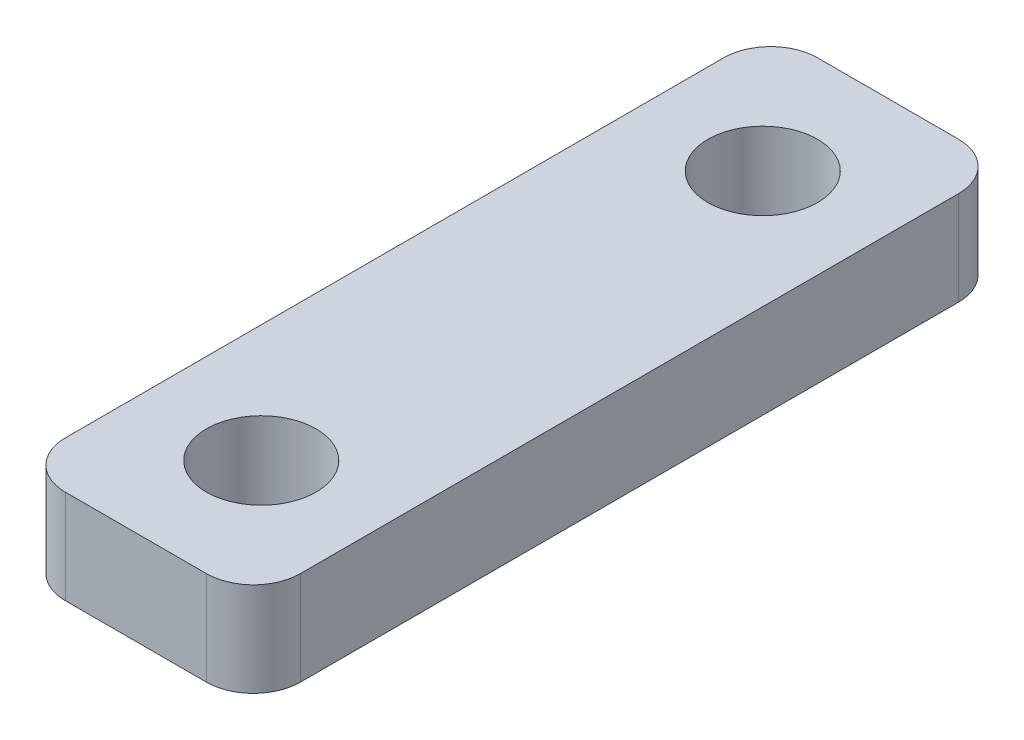
ISO-10303-21;
HEADER;
FILE_DESCRIPTION(('STEP AP214'),'2;1');
FILE_NAME('part.step','',(''),(''),'','','');
FILE_SCHEMA(('AUTOMOTIVE_DESIGN { 1 0 10303 214 1 1 1 1 }'));
ENDSEC;
DATA;
#1=APPLICATION_CONTEXT('core data for automotive mechanical design processes');
#2=APPLICATION_PROTOCOL_DEFINITION('international standard','automotive_design',2000,#1);
#3=PRODUCT_CONTEXT('',#1,'mechanical');
#4=PRODUCT('Part','Part','',(#3));
#5=PRODUCT_RELATED_PRODUCT_CATEGORY('part','',(#4));
#6=PRODUCT_DEFINITION_FORMATION('','',#4);
#7=PRODUCT_DEFINITION_CONTEXT('part definition',#1,'design');
#8=PRODUCT_DEFINITION('design','',#6,#7);
#9=PRODUCT_DEFINITION_SHAPE('','',#8);
#10=(LENGTH_UNIT() NAMED_UNIT(*) SI_UNIT(.MILLI.,.METRE.));
#11=(NAMED_UNIT(*) PLANE_ANGLE_UNIT() SI_UNIT($,.RADIAN.));
#12=(NAMED_UNIT(*) SI_UNIT($,.STERADIAN.) SOLID_ANGLE_UNIT());
#13=UNCERTAINTY_MEASURE_WITH_UNIT(LENGTH_MEASURE(1.E-05),#10,'distance_accuracy_value','');
#14=(GEOMETRIC_REPRESENTATION_CONTEXT(3) GLOBAL_UNCERTAINTY_ASSIGNED_CONTEXT((#13)) GLOBAL_UNIT_ASSIGNED_CONTEXT((#10,
#11,#12)) REPRESENTATION_CONTEXT('',''));
#15=CARTESIAN_POINT('',(0.,0.,0.));
#16=DIRECTION('',(0.,0.,1.));
#17=DIRECTION('',(1.,0.,0.));
#18=AXIS2_PLACEMENT_3D('',#15,#16,#17);
#19=CARTESIAN_POINT('',(3.,6.,0.));
#20=DIRECTION('',(0.,-1.,0.));
#21=DIRECTION('',(0.,0.,-1.));
#22=AXIS2_PLACEMENT_3D('',#19,#20,#21);
#23=PLANE('',#22);
#24=CARTESIAN_POINT('',(3.,6.,0.));
#25=DIRECTION('',(0.,1.,0.));
#26=DIRECTION('',(0.,0.,-1.));
#27=AXIS2_PLACEMENT_3D('',#24,#25,#26);
#28=CIRCLE('',#27,3.);
#29=CARTESIAN_POINT('',(0.,6.,0.));
#30=VERTEX_POINT('',#29);
#31=CARTESIAN_POINT('',(3.,6.,3.));
#32=VERTEX_POINT('',#31);
#33=EDGE_CURVE('E160',#30,#32,#28,.T.);
#34=ORIENTED_EDGE('',*,*,#33,.T.);
#35=DIRECTION('',(1.,0.,0.));
#36=VECTOR('',#35,1.);
#37=CARTESIAN_POINT('',(12.,6.,3.));
#38=LINE('',#37,#36);
#39=CARTESIAN_POINT('',(12.,6.,3.));
#40=VERTEX_POINT('',#39);
#41=EDGE_CURVE('E95',#32,#40,#38,.T.);
#42=ORIENTED_EDGE('',*,*,#41,.T.);
#43=CARTESIAN_POINT('',(12.,6.,0.));
#44=DIRECTION('',(0.,1.,0.));
#45=DIRECTION('',(0.,0.,-1.));
#46=AXIS2_PLACEMENT_3D('',#43,#44,#45);
#47=CIRCLE('',#46,3.);
#48=CARTESIAN_POINT('',(15.,6.,0.));
#49=VERTEX_POINT('',#48);
#50=EDGE_CURVE('E182',#40,#49,#47,.T.);
#51=ORIENTED_EDGE('',*,*,#50,.T.);
#52=DIRECTION('',(0.,0.,-1.));
#53=VECTOR('',#52,1.);
#54=CARTESIAN_POINT('',(15.,6.,-42.));
#55=LINE('',#54,#53);
#56=CARTESIAN_POINT('',(15.,6.,-42.));
#57=VERTEX_POINT('',#56);
#58=EDGE_CURVE('E196',#49,#57,#55,.T.);
#59=ORIENTED_EDGE('',*,*,#58,.T.);
#60=CARTESIAN_POINT('',(12.,6.,-42.));
#61=DIRECTION('',(0.,1.,0.));
#62=DIRECTION('',(0.,0.,-1.));
#63=AXIS2_PLACEMENT_3D('',#60,#61,#62);
#64=CIRCLE('',#63,3.);
#65=CARTESIAN_POINT('',(12.,6.,-45.));
#66=VERTEX_POINT('',#65);
#67=EDGE_CURVE('E114',#57,#66,#64,.T.);
#68=ORIENTED_EDGE('',*,*,#67,.T.);
#69=DIRECTION('',(-1.,0.,0.));
#70=VECTOR('',#69,1.);
#71=CARTESIAN_POINT('',(3.,6.,-45.));
#72=LINE('',#71,#70);
#73=CARTESIAN_POINT('',(3.,6.,-45.));
#74=VERTEX_POINT('',#73);
#75=EDGE_CURVE('E108',#66,#74,#72,.T.);
#76=ORIENTED_EDGE('',*,*,#75,.T.);
#77=CARTESIAN_POINT('',(3.,6.,-42.));
#78=DIRECTION('',(0.,1.,0.));
#79=DIRECTION('',(0.,0.,-1.));
#80=AXIS2_PLACEMENT_3D('',#77,#78,#79);
#81=CIRCLE('',#80,3.);
#82=CARTESIAN_POINT('',(0.,6.,-42.));
#83=VERTEX_POINT('',#82);
#84=EDGE_CURVE('E112',#74,#83,#81,.T.);
#85=ORIENTED_EDGE('',*,*,#84,.T.);
#86=DIRECTION('',(0.,0.,1.));
#87=VECTOR('',#86,1.);
#88=CARTESIAN_POINT('',(0.,6.,0.));
#89=LINE('',#88,#87);
#90=EDGE_CURVE('E52',#83,#30,#89,.T.);
#91=ORIENTED_EDGE('',*,*,#90,.T.);
#92=EDGE_LOOP('',(#34,#42,#51,#59,#68,#76,#85,#91));
#93=FACE_BOUND('',#92,.T.);
#94=CARTESIAN_POINT('',(7.5,6.,-37.));
#95=DIRECTION('',(0.,1.,0.));
#96=DIRECTION('',(0.,0.,1.));
#97=AXIS2_PLACEMENT_3D('',#94,#95,#96);
#98=CIRCLE('',#97,3.5);
#99=CARTESIAN_POINT('',(7.5,6.,-33.5));
#100=VERTEX_POINT('',#99);
#101=EDGE_CURVE('E142',#100,#100,#98,.T.);
#102=ORIENTED_EDGE('',*,*,#101,.F.);
#103=EDGE_LOOP('',(#102));
#104=FACE_BOUND('',#103,.T.);
#105=CARTESIAN_POINT('',(7.50000000000001,6.,-5.));
#106=DIRECTION('',(0.,1.,0.));
#107=DIRECTION('',(0.,0.,1.));
#108=AXIS2_PLACEMENT_3D('',#105,#106,#107);
#109=CIRCLE('',#108,3.5);
#110=CARTESIAN_POINT('',(7.50000000000001,6.,-1.5));
#111=VERTEX_POINT('',#110);
#112=EDGE_CURVE('E211',#111,#111,#109,.T.);
#113=ORIENTED_EDGE('',*,*,#112,.F.);
#114=EDGE_LOOP('',(#113));
#115=FACE_BOUND('',#114,.T.);
#116=ADVANCED_FACE('F34',(#93,#104,#115),#23,.F.);
#117=CARTESIAN_POINT('',(3.,0.,0.));
#118=DIRECTION('',(0.,-1.,0.));
#119=DIRECTION('',(0.,0.,-1.));
#120=AXIS2_PLACEMENT_3D('',#117,#118,#119);
#121=PLANE('',#120);
#122=CARTESIAN_POINT('',(7.5,0.,-37.));
#123=DIRECTION('',(0.,1.,0.));
#124=DIRECTION('',(0.,0.,1.));
#125=AXIS2_PLACEMENT_3D('',#122,#123,#124);
#126=CIRCLE('',#125,3.5);
#127=CARTESIAN_POINT('',(7.5,0.,-33.5));
#128=VERTEX_POINT('',#127);
#129=EDGE_CURVE('E207',#128,#128,#126,.T.);
#130=ORIENTED_EDGE('',*,*,#129,.T.);
#131=EDGE_LOOP('',(#130));
#132=FACE_BOUND('',#131,.T.);
#133=CARTESIAN_POINT('',(3.,0.,0.));
#134=DIRECTION('',(0.,1.,0.));
#135=DIRECTION('',(0.,0.,-1.));
#136=AXIS2_PLACEMENT_3D('',#133,#134,#135);
#137=CIRCLE('',#136,3.);
#138=CARTESIAN_POINT('',(0.,0.,0.));
#139=VERTEX_POINT('',#138);
#140=CARTESIAN_POINT('',(3.,0.,3.));
#141=VERTEX_POINT('',#140);
#142=EDGE_CURVE('E137',#139,#141,#137,.T.);
#143=ORIENTED_EDGE('',*,*,#142,.F.);
#144=DIRECTION('',(0.,0.,1.));
#145=VECTOR('',#144,1.);
#146=CARTESIAN_POINT('',(0.,0.,0.));
#147=LINE('',#146,#145);
#148=CARTESIAN_POINT('',(0.,0.,-42.));
#149=VERTEX_POINT('',#148);
#150=EDGE_CURVE('E87',#149,#139,#147,.T.);
#151=ORIENTED_EDGE('',*,*,#150,.F.);
#152=CARTESIAN_POINT('',(3.,0.,-42.));
#153=DIRECTION('',(0.,1.,0.));
#154=DIRECTION('',(0.,0.,-1.));
#155=AXIS2_PLACEMENT_3D('',#152,#153,#154);
#156=CIRCLE('',#155,3.);
#157=CARTESIAN_POINT('',(3.,0.,-45.));
#158=VERTEX_POINT('',#157);
#159=EDGE_CURVE('E81',#158,#149,#156,.T.);
#160=ORIENTED_EDGE('',*,*,#159,.F.);
#161=DIRECTION('',(-1.,0.,0.));
#162=VECTOR('',#161,1.);
#163=CARTESIAN_POINT('',(3.,0.,-45.));
#164=LINE('',#163,#162);
#165=CARTESIAN_POINT('',(12.,0.,-45.));
#166=VERTEX_POINT('',#165);
#167=EDGE_CURVE('E123',#166,#158,#164,.T.);
#168=ORIENTED_EDGE('',*,*,#167,.F.);
#169=CARTESIAN_POINT('',(12.,0.,-42.));
#170=DIRECTION('',(0.,1.,0.));
#171=DIRECTION('',(0.,0.,-1.));
#172=AXIS2_PLACEMENT_3D('',#169,#170,#171);
#173=CIRCLE('',#172,3.);
#174=CARTESIAN_POINT('',(15.,0.,-42.));
#175=VERTEX_POINT('',#174);
#176=EDGE_CURVE('E151',#175,#166,#173,.T.);
#177=ORIENTED_EDGE('',*,*,#176,.F.);
#178=DIRECTION('',(0.,0.,-1.));
#179=VECTOR('',#178,1.);
#180=CARTESIAN_POINT('',(15.,0.,-42.));
#181=LINE('',#180,#179);
#182=CARTESIAN_POINT('',(15.,0.,0.));
#183=VERTEX_POINT('',#182);
#184=EDGE_CURVE('E148',#183,#175,#181,.T.);
#185=ORIENTED_EDGE('',*,*,#184,.F.);
#186=CARTESIAN_POINT('',(12.,0.,0.));
#187=DIRECTION('',(0.,1.,0.));
#188=DIRECTION('',(0.,0.,-1.));
#189=AXIS2_PLACEMENT_3D('',#186,#187,#188);
#190=CIRCLE('',#189,3.);
#191=CARTESIAN_POINT('',(12.,0.,3.));
#192=VERTEX_POINT('',#191);
#193=EDGE_CURVE('E145',#192,#183,#190,.T.);
#194=ORIENTED_EDGE('',*,*,#193,.F.);
#195=DIRECTION('',(1.,0.,0.));
#196=VECTOR('',#195,1.);
#197=CARTESIAN_POINT('',(12.,0.,3.));
#198=LINE('',#197,#196);
#199=EDGE_CURVE('E141',#141,#192,#198,.T.);
#200=ORIENTED_EDGE('',*,*,#199,.F.);
#201=EDGE_LOOP('',(#143,#151,#160,#168,#177,#185,#194,#200));
#202=FACE_BOUND('',#201,.T.);
#203=CARTESIAN_POINT('',(7.50000000000001,0.,-5.));
#204=DIRECTION('',(0.,1.,0.));
#205=DIRECTION('',(0.,0.,1.));
#206=AXIS2_PLACEMENT_3D('',#203,#204,#205);
#207=CIRCLE('',#206,3.5);
#208=CARTESIAN_POINT('',(7.50000000000001,0.,-1.5));
#209=VERTEX_POINT('',#208);
#210=EDGE_CURVE('E215',#209,#209,#207,.T.);
#211=ORIENTED_EDGE('',*,*,#210,.T.);
#212=EDGE_LOOP('',(#211));
#213=FACE_BOUND('',#212,.T.);
#214=ADVANCED_FACE('F186',(#132,#202,#213),#121,.T.);
#215=CARTESIAN_POINT('',(3.,6.,0.));
#216=DIRECTION('',(0.,-1.,0.));
#217=DIRECTION('',(0.,0.,-1.));
#218=AXIS2_PLACEMENT_3D('',#215,#216,#217);
#219=CYLINDRICAL_SURFACE('',#218,3.);
#220=ORIENTED_EDGE('',*,*,#142,.T.);
#221=DIRECTION('',(0.,-1.,0.));
#222=VECTOR('',#221,1.);
#223=CARTESIAN_POINT('',(3.,6.,3.));
#224=LINE('',#223,#222);
#225=EDGE_CURVE('E11',#32,#141,#224,.T.);
#226=ORIENTED_EDGE('',*,*,#225,.F.);
#227=ORIENTED_EDGE('',*,*,#33,.F.);
#228=DIRECTION('',(0.,-1.,0.));
#229=VECTOR('',#228,1.);
#230=CARTESIAN_POINT('',(0.,6.,0.));
#231=LINE('',#230,#229);
#232=EDGE_CURVE('E133',#30,#139,#231,.T.);
#233=ORIENTED_EDGE('',*,*,#232,.T.);
#234=EDGE_LOOP('',(#220,#226,#227,#233));
#235=FACE_BOUND('',#234,.T.);
#236=ADVANCED_FACE('F36',(#235),#219,.T.);
#237=CARTESIAN_POINT('',(12.,6.,3.));
#238=DIRECTION('',(0.,0.,-1.));
#239=DIRECTION('',(-1.,0.,0.));
#240=AXIS2_PLACEMENT_3D('',#237,#238,#239);
#241=PLANE('',#240);
#242=ORIENTED_EDGE('',*,*,#199,.T.);
#243=DIRECTION('',(0.,-1.,0.));
#244=VECTOR('',#243,1.);
#245=CARTESIAN_POINT('',(12.,6.,3.));
#246=LINE('',#245,#244);
#247=EDGE_CURVE('E44',#40,#192,#246,.T.);
#248=ORIENTED_EDGE('',*,*,#247,.F.);
#249=ORIENTED_EDGE('',*,*,#41,.F.);
#250=ORIENTED_EDGE('',*,*,#225,.T.);
#251=EDGE_LOOP('',(#242,#248,#249,#250));
#252=FACE_BOUND('',#251,.T.);
#253=ADVANCED_FACE('F250',(#252),#241,.F.);
#254=CARTESIAN_POINT('',(12.,6.,0.));
#255=DIRECTION('',(0.,-1.,0.));
#256=DIRECTION('',(0.,0.,-1.));
#257=AXIS2_PLACEMENT_3D('',#254,#255,#256);
#258=CYLINDRICAL_SURFACE('',#257,3.);
#259=ORIENTED_EDGE('',*,*,#193,.T.);
#260=DIRECTION('',(0.,-1.,0.));
#261=VECTOR('',#260,1.);
#262=CARTESIAN_POINT('',(15.,6.,0.));
#263=LINE('',#262,#261);
#264=EDGE_CURVE('E171',#49,#183,#263,.T.);
#265=ORIENTED_EDGE('',*,*,#264,.F.);
#266=ORIENTED_EDGE('',*,*,#50,.F.);
#267=ORIENTED_EDGE('',*,*,#247,.T.);
#268=EDGE_LOOP('',(#259,#265,#266,#267));
#269=FACE_BOUND('',#268,.T.);
#270=ADVANCED_FACE('F180',(#269),#258,.T.);
#271=CARTESIAN_POINT('',(15.,6.,-42.));
#272=DIRECTION('',(-1.,0.,0.));
#273=DIRECTION('',(0.,0.,1.));
#274=AXIS2_PLACEMENT_3D('',#271,#272,#273);
#275=PLANE('',#274);
#276=ORIENTED_EDGE('',*,*,#184,.T.);
#277=DIRECTION('',(0.,-1.,0.));
#278=VECTOR('',#277,1.);
#279=CARTESIAN_POINT('',(15.,6.,-42.));
#280=LINE('',#279,#278);
#281=EDGE_CURVE('E167',#57,#175,#280,.T.);
#282=ORIENTED_EDGE('',*,*,#281,.F.);
#283=ORIENTED_EDGE('',*,*,#58,.F.);
#284=ORIENTED_EDGE('',*,*,#264,.T.);
#285=EDGE_LOOP('',(#276,#282,#283,#284));
#286=FACE_BOUND('',#285,.T.);
#287=ADVANCED_FACE('F191',(#286),#275,.F.);
#288=CARTESIAN_POINT('',(12.,6.,-42.));
#289=DIRECTION('',(0.,-1.,0.));
#290=DIRECTION('',(0.,0.,-1.));
#291=AXIS2_PLACEMENT_3D('',#288,#289,#290);
#292=CYLINDRICAL_SURFACE('',#291,3.);
#293=ORIENTED_EDGE('',*,*,#176,.T.);
#294=DIRECTION('',(0.,-1.,0.));
#295=VECTOR('',#294,1.);
#296=CARTESIAN_POINT('',(12.,6.,-45.));
#297=LINE('',#296,#295);
#298=EDGE_CURVE('E125',#66,#166,#297,.T.);
#299=ORIENTED_EDGE('',*,*,#298,.F.);
#300=ORIENTED_EDGE('',*,*,#67,.F.);
#301=ORIENTED_EDGE('',*,*,#281,.T.);
#302=EDGE_LOOP('',(#293,#299,#300,#301));
#303=FACE_BOUND('',#302,.T.);
#304=ADVANCED_FACE('F194',(#303),#292,.T.);
#305=CARTESIAN_POINT('',(3.,6.,-45.));
#306=DIRECTION('',(0.,0.,1.));
#307=DIRECTION('',(1.,0.,0.));
#308=AXIS2_PLACEMENT_3D('',#305,#306,#307);
#309=PLANE('',#308);
#310=ORIENTED_EDGE('',*,*,#167,.T.);
#311=DIRECTION('',(0.,-1.,0.));
#312=VECTOR('',#311,1.);
#313=CARTESIAN_POINT('',(3.,6.,-45.));
#314=LINE('',#313,#312);
#315=EDGE_CURVE('E120',#74,#158,#314,.T.);
#316=ORIENTED_EDGE('',*,*,#315,.F.);
#317=ORIENTED_EDGE('',*,*,#75,.F.);
#318=ORIENTED_EDGE('',*,*,#298,.T.);
#319=EDGE_LOOP('',(#310,#316,#317,#318));
#320=FACE_BOUND('',#319,.T.);
#321=ADVANCED_FACE('F121',(#320),#309,.F.);
#322=CARTESIAN_POINT('',(3.,6.,-42.));
#323=DIRECTION('',(0.,-1.,0.));
#324=DIRECTION('',(0.,0.,-1.));
#325=AXIS2_PLACEMENT_3D('',#322,#323,#324);
#326=CYLINDRICAL_SURFACE('',#325,3.);
#327=ORIENTED_EDGE('',*,*,#159,.T.);
#328=DIRECTION('',(0.,-1.,0.));
#329=VECTOR('',#328,1.);
#330=CARTESIAN_POINT('',(0.,6.,-42.));
#331=LINE('',#330,#329);
#332=EDGE_CURVE('E126',#83,#149,#331,.T.);
#333=ORIENTED_EDGE('',*,*,#332,.F.);
#334=ORIENTED_EDGE('',*,*,#84,.F.);
#335=ORIENTED_EDGE('',*,*,#315,.T.);
#336=EDGE_LOOP('',(#327,#333,#334,#335));
#337=FACE_BOUND('',#336,.T.);
#338=ADVANCED_FACE('F128',(#337),#326,.T.);
#339=CARTESIAN_POINT('',(0.,6.,0.));
#340=DIRECTION('',(1.,0.,0.));
#341=DIRECTION('',(0.,0.,-1.));
#342=AXIS2_PLACEMENT_3D('',#339,#340,#341);
#343=PLANE('',#342);
#344=ORIENTED_EDGE('',*,*,#150,.T.);
#345=ORIENTED_EDGE('',*,*,#232,.F.);
#346=ORIENTED_EDGE('',*,*,#90,.F.);
#347=ORIENTED_EDGE('',*,*,#332,.T.);
#348=EDGE_LOOP('',(#344,#345,#346,#347));
#349=FACE_BOUND('',#348,.T.);
#350=ADVANCED_FACE('F238',(#349),#343,.F.);
#351=CARTESIAN_POINT('',(7.5,6.,-37.));
#352=DIRECTION('',(0.,-1.,0.));
#353=DIRECTION('',(0.,0.,-1.));
#354=AXIS2_PLACEMENT_3D('',#351,#352,#353);
#355=CYLINDRICAL_SURFACE('',#354,3.5);
#356=ORIENTED_EDGE('',*,*,#101,.T.);
#357=EDGE_LOOP('',(#356));
#358=FACE_BOUND('',#357,.T.);
#359=ORIENTED_EDGE('',*,*,#129,.F.);
#360=EDGE_LOOP('',(#359));
#361=FACE_BOUND('',#360,.T.);
#362=ADVANCED_FACE('F235',(#358,#361),#355,.F.);
#363=CARTESIAN_POINT('',(7.50000000000001,6.,-5.));
#364=DIRECTION('',(0.,-1.,0.));
#365=DIRECTION('',(0.,0.,-1.));
#366=AXIS2_PLACEMENT_3D('',#363,#364,#365);
#367=CYLINDRICAL_SURFACE('',#366,3.5);
#368=ORIENTED_EDGE('',*,*,#112,.T.);
#369=EDGE_LOOP('',(#368));
#370=FACE_BOUND('',#369,.T.);
#371=ORIENTED_EDGE('',*,*,#210,.F.);
#372=EDGE_LOOP('',(#371));
#373=FACE_BOUND('',#372,.T.);
#374=ADVANCED_FACE('F224',(#370,#373),#367,.F.);
#375=CLOSED_SHELL('',(#116,#214,#236,#253,#270,#287,#304,#321,#338,#350,#362,#374));
#376=MANIFOLD_SOLID_BREP('B2',#375);
#377=ADVANCED_BREP_SHAPE_REPRESENTATION('',(#18,#376),#14);
#378=SHAPE_DEFINITION_REPRESENTATION(#9,#377);
ENDSEC;
END-ISO-10303-21;
